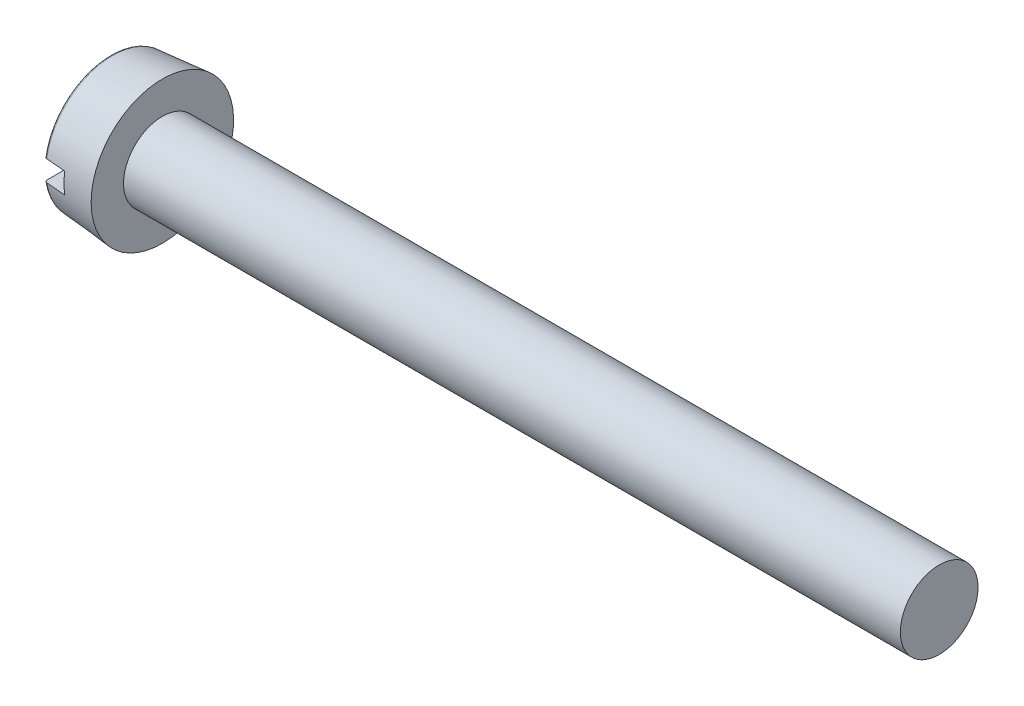
ISO-10303-21;
HEADER;
FILE_DESCRIPTION(('STEP AP214'),'2;1');
FILE_NAME('part.step','',(''),(''),'','','');
FILE_SCHEMA(('AUTOMOTIVE_DESIGN { 1 0 10303 214 1 1 1 1 }'));
ENDSEC;
DATA;
#1=APPLICATION_CONTEXT('core data for automotive mechanical design processes');
#2=APPLICATION_PROTOCOL_DEFINITION('international standard','automotive_design',2000,#1);
#3=PRODUCT_CONTEXT('',#1,'mechanical');
#4=PRODUCT('Part','Part','',(#3));
#5=PRODUCT_RELATED_PRODUCT_CATEGORY('part','',(#4));
#6=PRODUCT_DEFINITION_FORMATION('','',#4);
#7=PRODUCT_DEFINITION_CONTEXT('part definition',#1,'design');
#8=PRODUCT_DEFINITION('design','',#6,#7);
#9=PRODUCT_DEFINITION_SHAPE('','',#8);
#10=(LENGTH_UNIT() NAMED_UNIT(*) SI_UNIT(.MILLI.,.METRE.));
#11=(NAMED_UNIT(*) PLANE_ANGLE_UNIT() SI_UNIT($,.RADIAN.));
#12=(NAMED_UNIT(*) SI_UNIT($,.STERADIAN.) SOLID_ANGLE_UNIT());
#13=UNCERTAINTY_MEASURE_WITH_UNIT(LENGTH_MEASURE(1.E-05),#10,'distance_accuracy_value','');
#14=(GEOMETRIC_REPRESENTATION_CONTEXT(3) GLOBAL_UNCERTAINTY_ASSIGNED_CONTEXT((#13)) GLOBAL_UNIT_ASSIGNED_CONTEXT((#10,
#11,#12)) REPRESENTATION_CONTEXT('',''));
#15=CARTESIAN_POINT('',(0.,0.,0.));
#16=DIRECTION('',(0.,0.,1.));
#17=DIRECTION('',(1.,0.,0.));
#18=AXIS2_PLACEMENT_3D('',#15,#16,#17);
#19=CARTESIAN_POINT('',(0.,0.,0.));
#20=DIRECTION('',(-1.,0.,0.));
#21=DIRECTION('',(0.,0.,1.));
#22=AXIS2_PLACEMENT_3D('',#19,#20,#21);
#23=PLANE('',#22);
#24=DIRECTION('',(0.,0.,-1.));
#25=VECTOR('',#24,1.);
#26=CARTESIAN_POINT('',(0.,0.4,2.75));
#27=LINE('',#26,#25);
#28=CARTESIAN_POINT('',(0.,0.4,2.45096382768024));
#29=VERTEX_POINT('',#28);
#30=CARTESIAN_POINT('',(0.,0.4,-2.45096382768024));
#31=VERTEX_POINT('',#30);
#32=EDGE_CURVE('E106',#29,#31,#27,.T.);
#33=ORIENTED_EDGE('',*,*,#32,.F.);
#34=CARTESIAN_POINT('',(0.,0.,0.));
#35=DIRECTION('',(-1.,0.,0.));
#36=DIRECTION('',(0.,0.,1.));
#37=AXIS2_PLACEMENT_3D('',#34,#35,#36);
#38=CIRCLE('',#37,2.48338955554641);
#39=EDGE_CURVE('E108',#29,#31,#38,.T.);
#40=ORIENTED_EDGE('',*,*,#39,.T.);
#41=EDGE_LOOP('',(#33,#40));
#42=FACE_BOUND('',#41,.T.);
#43=ADVANCED_FACE('F37',(#42),#23,.T.);
#44=CARTESIAN_POINT('',(0.1,0.,0.));
#45=DIRECTION('',(-1.,0.,0.));
#46=DIRECTION('',(0.,0.,1.));
#47=AXIS2_PLACEMENT_3D('',#44,#45,#46);
#48=TOROIDAL_SURFACE('',#47,2.48338955554641,0.1);
#49=CARTESIAN_POINT('',(0.0289938380211758,0.4,-2.52228316549766));
#50=CARTESIAN_POINT('',(0.0329146400399008,0.4,-2.52628601737879));
#51=CARTESIAN_POINT('',(0.0371732059087858,0.4,-2.52996330795833));
#52=CARTESIAN_POINT('',(0.0462494374841123,0.4,-2.53655558833691));
#53=CARTESIAN_POINT('',(0.0510676904570524,0.4,-2.53946976679747));
#54=CARTESIAN_POINT('',(0.061126618897454,0.4,-2.54444525866304));
#55=CARTESIAN_POINT('',(0.0663672780390149,0.4,-2.54650660501096));
#56=CARTESIAN_POINT('',(0.0771205298537036,0.4,-2.5497128714041));
#57=CARTESIAN_POINT('',(0.0826330564249979,0.4,-2.55085801306043));
#58=CARTESIAN_POINT('',(0.0937360108304329,0.4,-2.55219318080891));
#59=CARTESIAN_POINT('',(0.0993256947509507,0.4,-2.55238939597481));
#60=CARTESIAN_POINT('',(0.110458306622038,0.4,-2.55183747650024));
#61=CARTESIAN_POINT('',(0.116001234198317,0.4,-2.55108933430727));
#62=CARTESIAN_POINT('',(0.12686581978363,0.4,-2.54867516285271));
#63=CARTESIAN_POINT('',(0.132188090847035,0.4,-2.54701188972794));
#64=CARTESIAN_POINT('',(0.142479668135713,0.4,-2.54281935144472));
#65=CARTESIAN_POINT('',(0.147448970444545,0.4,-2.54029007667919));
#66=CARTESIAN_POINT('',(0.156919019556883,0.4,-2.53442699567865));
#67=CARTESIAN_POINT('',(0.161417530686884,0.4,-2.53108957986598));
#68=CARTESIAN_POINT('',(0.169797583318729,0.4,-2.52371398467404));
#69=CARTESIAN_POINT('',(0.173679096427555,0.4,-2.51967577306341));
#70=CARTESIAN_POINT('',(0.180758379631838,0.4,-2.51096934806693));
#71=CARTESIAN_POINT('',(0.183948691710373,0.4,-2.50629507144611));
#72=CARTESIAN_POINT('',(0.189510239570671,0.4,-2.49648236653712));
#73=CARTESIAN_POINT('',(0.191881421883502,0.4,-2.49134390797695));
#74=CARTESIAN_POINT('',(0.195767027940457,0.4,-2.480682205207));
#75=CARTESIAN_POINT('',(0.197270760971853,0.4,-2.47515506403468));
#76=CARTESIAN_POINT('',(0.199338128353477,0.4,-2.46392763420021));
#77=CARTESIAN_POINT('',(0.199901709526225,0.4,-2.45822733576239));
#78=CARTESIAN_POINT('',(0.20007548133907,0.4,-2.44676112412241));
#79=CARTESIAN_POINT('',(0.199677113345941,0.4,-2.44099507954687));
#80=CARTESIAN_POINT('',(0.197919889661747,0.4,-2.42961109138142));
#81=CARTESIAN_POINT('',(0.196561010768147,0.4,-2.42399315137259));
#82=CARTESIAN_POINT('',(0.192915627153958,0.4,-2.41305590565846));
#83=CARTESIAN_POINT('',(0.190627555523932,0.4,-2.40773712175833));
#84=CARTESIAN_POINT('',(0.185185000915828,0.4,-2.39756279520369));
#85=CARTESIAN_POINT('',(0.182030540035586,0.4,-2.39270724073845));
#86=CARTESIAN_POINT('',(0.174965864483064,0.4,-2.38363467595376));
#87=CARTESIAN_POINT('',(0.17106099829442,0.4,-2.37941350258365));
#88=CARTESIAN_POINT('',(0.162589830789107,0.4,-2.37169707517616));
#89=CARTESIAN_POINT('',(0.158023574903146,0.4,-2.36820177131908));
#90=CARTESIAN_POINT('',(0.148421596079081,0.4,-2.36208459946197));
#91=CARTESIAN_POINT('',(0.14339263640465,0.4,-2.35945211619946));
#92=CARTESIAN_POINT('',(0.132960042691407,0.4,-2.35508144798975));
#93=CARTESIAN_POINT('',(0.127556438263748,0.4,-2.35334319245586));
#94=CARTESIAN_POINT('',(0.116602502745339,0.4,-2.35083201602087));
#95=CARTESIAN_POINT('',(0.111054942498254,0.4,-2.35004699968965));
#96=CARTESIAN_POINT('',(0.0999070705254344,0.4,-2.3494263065429));
#97=CARTESIAN_POINT('',(0.0943067613612006,0.4,-2.34959058386431));
#98=CARTESIAN_POINT('',(0.0832511443149576,0.4,-2.35085902950956));
#99=CARTESIAN_POINT('',(0.0777951256899436,0.4,-2.3519570180145));
#100=CARTESIAN_POINT('',(0.0671440893672225,0.4,-2.35505088710293));
#101=CARTESIAN_POINT('',(0.0619490721184748,0.4,-2.35704676923086));
#102=CARTESIAN_POINT('',(0.0519500535749688,0.4,-2.36188301447907));
#103=CARTESIAN_POINT('',(0.0471472182076571,0.4,-2.36472578664258));
#104=CARTESIAN_POINT('',(0.038080294755097,0.4,-2.37116917771983));
#105=CARTESIAN_POINT('',(0.0338162339656365,0.4,-2.37476983500548));
#106=CARTESIAN_POINT('',(0.0258978392798659,0.4,-2.38266730942151));
#107=CARTESIAN_POINT('',(0.0222505790304378,0.4,-2.38697121737475));
#108=CARTESIAN_POINT('',(0.0157188388686,0.4,-2.39612333377568));
#109=CARTESIAN_POINT('',(0.0128344147286459,0.4,-2.40097158198427));
#110=CARTESIAN_POINT('',(0.00786953684593871,0.4,-2.41114518595604));
#111=CARTESIAN_POINT('',(0.00580049504437317,0.4,-2.41647611188959));
#112=CARTESIAN_POINT('',(0.0025766828223988,0.4,-2.4274074136993));
#113=CARTESIAN_POINT('',(0.00142193421228871,0.4,-2.4330077959999));
#114=CARTESIAN_POINT('',(4.98309082451478E-05,0.4,-2.44437919860998));
#115=CARTESIAN_POINT('',(-0.000158040154989019,0.4,-2.45015136490808));
#116=CARTESIAN_POINT('',(0.000395629680353794,0.4,-2.46165070249477));
#117=CARTESIAN_POINT('',(0.00115743264880506,0.4,-2.46737786119837));
#118=CARTESIAN_POINT('',(0.00363465605126292,0.4,-2.47863907342415));
#119=CARTESIAN_POINT('',(0.0053528137035001,0.4,-2.48417252398631));
#120=CARTESIAN_POINT('',(0.00969850669250343,0.4,-2.49486489969062));
#121=CARTESIAN_POINT('',(0.0123249394519184,0.4,-2.50002426979425));
#122=CARTESIAN_POINT('',(0.0173136943959969,0.4,-2.50805181152184));
#123=CARTESIAN_POINT('',(0.019430082640619,0.4,-2.51107561025655));
#124=CARTESIAN_POINT('',(0.0239801784125786,0.4,-2.51687431501129));
#125=CARTESIAN_POINT('',(0.0264138847052187,0.4,-2.5196492219997));
#126=CARTESIAN_POINT('',(0.0289938380211758,0.4,-2.52228316549766));
#127=B_SPLINE_CURVE_WITH_KNOTS('',3,(#49,#50,#51,#52,#53,#54,#55,#56,#57,#58,#59,#60,#61,#62,
#63,#64,#65,#66,#67,#68,#69,#70,#71,#72,#73,#74,#75,#76,#77,#78,#79,#80,#81,#82,#83,#84,#85,#86,
#87,#88,#89,#90,#91,#92,#93,#94,#95,#96,#97,#98,#99,#100,#101,#102,#103,#104,#105,#106,#107,
#108,#109,#110,#111,#112,#113,#114,#115,#116,#117,#118,#119,#120,#121,#122,#123,#124,#125,#126),
.UNSPECIFIED.,.T.,.F.,(4,2,2,2,2,2,2,2,2,2,2,2,2,2,2,2,2,2,2,2,2,2,2,2,2,2,2,2,2,2,2,2,2,2,2,2,
2,2,4),(0.,0.0167962438770802,0.0336102736228912,0.0504236538216824,0.0672329659785202,
0.0839324954656501,0.100632158508098,0.11728179964717,0.133931625497132,0.150657236214899,
0.167383616389182,0.184282358747594,0.201182203967943,0.218286107817179,0.235390979075726,
0.252648595290838,0.269906628402955,0.287193885606231,0.304480701927405,0.321648593971803,
0.338815307316329,0.355762112546912,0.372707579860325,0.389435704571816,0.406163021106999,
0.422780481006365,0.439397969489147,0.456063186523276,0.472729247524451,0.489575093862968,
0.506422171494332,0.523497308438318,0.540572852694337,0.557819049576411,0.575069908508114,
0.592370397548948,0.609649958399181,0.620702210843321,0.631754420283977),.UNSPECIFIED.);
#128=CARTESIAN_POINT('',(0.0912844257252299,0.4,-2.5518494518816));
#129=VERTEX_POINT('',#128);
#130=EDGE_CURVE('E61',#31,#129,#127,.T.);
#131=ORIENTED_EDGE('',*,*,#130,.F.);
#132=ORIENTED_EDGE('',*,*,#39,.F.);
#133=CARTESIAN_POINT('',(0.0367676987021643,0.4,2.37243473528728));
#134=CARTESIAN_POINT('',(0.0410691072562519,0.4,2.36887462682049));
#135=CARTESIAN_POINT('',(0.0456712476146379,0.4,2.36567202074306));
#136=CARTESIAN_POINT('',(0.0553504912178822,0.4,2.36008032650183));
#137=CARTESIAN_POINT('',(0.0604280839551132,0.4,2.35769208875703));
#138=CARTESIAN_POINT('',(0.0709135886904199,0.4,2.35380489827384));
#139=CARTESIAN_POINT('',(0.0763214938192331,0.4,2.35230592704897));
#140=CARTESIAN_POINT('',(0.0873116719417479,0.4,2.35024450872371));
#141=CARTESIAN_POINT('',(0.0928939027986416,0.4,2.34968183706536));
#142=CARTESIAN_POINT('',(0.104036601297581,0.4,2.34951039508072));
#143=CARTESIAN_POINT('',(0.109596974662459,0.4,2.34989545024077));
#144=CARTESIAN_POINT('',(0.120573920357346,0.4,2.35159460899385));
#145=CARTESIAN_POINT('',(0.125990490202903,0.4,2.35290872862725));
#146=CARTESIAN_POINT('',(0.136522391247531,0.4,2.35642416504567));
#147=CARTESIAN_POINT('',(0.141637967615106,0.4,2.35862474798458));
#148=CARTESIAN_POINT('',(0.151431222534294,0.4,2.36384674458521));
#149=CARTESIAN_POINT('',(0.156108887376012,0.4,2.36686818393429));
#150=CARTESIAN_POINT('',(0.164936002938918,0.4,2.37367095440966));
#151=CARTESIAN_POINT('',(0.16908079389346,0.4,2.3774583297866));
#152=CARTESIAN_POINT('',(0.176685910750912,0.4,2.38566704388047));
#153=CARTESIAN_POINT('',(0.180146192360979,0.4,2.39008842359027));
#154=CARTESIAN_POINT('',(0.186332746435633,0.4,2.39950205527751));
#155=CARTESIAN_POINT('',(0.189048713902264,0.4,2.40450107962601));
#156=CARTESIAN_POINT('',(0.193614409893133,0.4,2.41488017557624));
#157=CARTESIAN_POINT('',(0.195464077650946,0.4,2.42026027387786));
#158=CARTESIAN_POINT('',(0.198266231334811,0.4,2.43131856240102));
#159=CARTESIAN_POINT('',(0.199207620171234,0.4,2.43699956654937));
#160=CARTESIAN_POINT('',(0.20012925691986,0.4,2.4484391128062));
#161=CARTESIAN_POINT('',(0.200109464431673,0.4,2.45419765816372));
#162=CARTESIAN_POINT('',(0.199105792419158,0.4,2.46566309979117));
#163=CARTESIAN_POINT('',(0.198116473192368,0.4,2.47136952123461));
#164=CARTESIAN_POINT('',(0.195191128966346,0.4,2.48253449565389));
#165=CARTESIAN_POINT('',(0.193255106776879,0.4,2.48799304936533));
#166=CARTESIAN_POINT('',(0.188494675278442,0.4,2.49848893070217));
#167=CARTESIAN_POINT('',(0.185672880951562,0.4,2.50352744366316));
#168=CARTESIAN_POINT('',(0.17921549855744,0.4,2.51305299197626));
#169=CARTESIAN_POINT('',(0.175579948629359,0.4,2.51754005315861));
#170=CARTESIAN_POINT('',(0.167635478825505,0.4,2.52578731588122));
#171=CARTESIAN_POINT('',(0.163333512373971,0.4,2.5295542142048));
#172=CARTESIAN_POINT('',(0.15415155549012,0.4,2.53630156216166));
#173=CARTESIAN_POINT('',(0.149271604711318,0.4,2.53928206570155));
#174=CARTESIAN_POINT('',(0.13913635307135,0.4,2.54433379308572));
#175=CARTESIAN_POINT('',(0.133886369113006,0.4,2.54641568563766));
#176=CARTESIAN_POINT('',(0.12310939474746,0.4,2.54965893225548));
#177=CARTESIAN_POINT('',(0.117582421034198,0.4,2.55082034172732));
#178=CARTESIAN_POINT('',(0.106464698916145,0.4,2.55218028189334));
#179=CARTESIAN_POINT('',(0.100875054594366,0.4,2.55238785185234));
#180=CARTESIAN_POINT('',(0.0897407847209884,0.4,2.55185843737951));
#181=CARTESIAN_POINT('',(0.0841961579348964,0.4,2.55112147893765));
#182=CARTESIAN_POINT('',(0.0733265657266888,0.4,2.54872918263962));
#183=CARTESIAN_POINT('',(0.0680009847337694,0.4,2.54707663871121));
#184=CARTESIAN_POINT('',(0.0577010526378295,0.4,2.54290481605141));
#185=CARTESIAN_POINT('',(0.0527267057044024,0.4,2.54038552703274));
#186=CARTESIAN_POINT('',(0.0432451955154216,0.4,2.53454156724995));
#187=CARTESIAN_POINT('',(0.038740238948066,0.4,2.53121331773258));
#188=CARTESIAN_POINT('',(0.0303458654217717,0.4,2.52385482922166));
#189=CARTESIAN_POINT('',(0.0264564786942822,0.4,2.51982455577117));
#190=CARTESIAN_POINT('',(0.0193602742266985,0.4,2.51113277232454));
#191=CARTESIAN_POINT('',(0.016160883105245,0.4,2.50646520000313));
#192=CARTESIAN_POINT('',(0.0105801862776836,0.4,2.49666430232761));
#193=CARTESIAN_POINT('',(0.00819893477648334,0.4,2.491530946142));
#194=CARTESIAN_POINT('',(0.00429230007908589,0.4,2.48087765570879));
#195=CARTESIAN_POINT('',(0.00277761888662445,0.4,2.47535379620009));
#196=CARTESIAN_POINT('',(0.00068799544056708,0.4,2.46413127035624));
#197=CARTESIAN_POINT('',(0.000113070892212463,0.4,2.45843260072968));
#198=CARTESIAN_POINT('',(-8.37002456025671E-05,0.4,2.44696818040157));
#199=CARTESIAN_POINT('',(0.000302941335767599,0.4,2.44120228266165));
#200=CARTESIAN_POINT('',(0.0020370100173356,0.4,2.42981508207598));
#201=CARTESIAN_POINT('',(0.00338469494754002,0.4,2.42419381845226));
#202=CARTESIAN_POINT('',(0.00700896577894915,0.4,2.41324562761761));
#203=CARTESIAN_POINT('',(0.00928760515722934,0.4,2.40791938083122));
#204=CARTESIAN_POINT('',(0.0147114792186617,0.4,2.39773348978099));
#205=CARTESIAN_POINT('',(0.0178556585516148,0.4,2.39287328693998));
#206=CARTESIAN_POINT('',(0.0236503626604921,0.4,2.38539954815907));
#207=CARTESIAN_POINT('',(0.0260726096208587,0.4,2.38260604033144));
#208=CARTESIAN_POINT('',(0.0312086078085589,0.4,2.37730112356));
#209=CARTESIAN_POINT('',(0.0339223576900255,0.4,2.37478971331387));
#210=CARTESIAN_POINT('',(0.0367676987021643,0.4,2.37243473528728));
#211=B_SPLINE_CURVE_WITH_KNOTS('',3,(#133,#134,#135,#136,#137,#138,#139,#140,#141,#142,#143,
#144,#145,#146,#147,#148,#149,#150,#151,#152,#153,#154,#155,#156,#157,#158,#159,#160,#161,#162,
#163,#164,#165,#166,#167,#168,#169,#170,#171,#172,#173,#174,#175,#176,#177,#178,#179,#180,#181,
#182,#183,#184,#185,#186,#187,#188,#189,#190,#191,#192,#193,#194,#195,#196,#197,#198,#199,#200,
#201,#202,#203,#204,#205,#206,#207,#208,#209,#210),.UNSPECIFIED.,.T.,.F.,(4,2,2,2,2,2,2,2,2,2,2,
2,2,2,2,2,2,2,2,2,2,2,2,2,2,2,2,2,2,2,2,2,2,2,2,2,2,2,4),(0.,0.0167374978406355,
0.0334924209723803,0.0502469957829487,0.0669975516708022,0.0836392656129614,0.100281266882441,
0.116909519525703,0.133538292583203,0.150303803185788,0.167070398286947,0.18405857971598,
0.201047952599288,0.218242362613188,0.235437495343469,0.252729660021829,0.270021773378245,
0.287263309496308,0.304504037705845,0.321575685446243,0.338646162637364,0.35550798995053,
0.372368802234774,0.389069495340301,0.405769728913956,0.422419279849294,0.439069028402679,
0.455793818907913,0.472519430535029,0.489416954805598,0.506315598386582,0.523418666684378,
0.540522057204383,0.557776961903069,0.57503649751328,0.592334311120995,0.609611126268918,
0.620682873655479,0.631754569926062),.UNSPECIFIED.);
#212=CARTESIAN_POINT('',(0.0912844257243784,0.4,2.55184945188522));
#213=VERTEX_POINT('',#212);
#214=EDGE_CURVE('E98',#213,#29,#211,.T.);
#215=ORIENTED_EDGE('',*,*,#214,.F.);
#216=CARTESIAN_POINT('',(0.0912844257252299,0.,0.));
#217=DIRECTION('',(-1.,0.,0.));
#218=DIRECTION('',(0.,0.,1.));
#219=AXIS2_PLACEMENT_3D('',#216,#217,#218);
#220=CIRCLE('',#219,2.58300902535558);
#221=EDGE_CURVE('E112',#129,#213,#220,.F.);
#222=ORIENTED_EDGE('',*,*,#221,.F.);
#223=EDGE_LOOP('',(#131,#132,#215,#222));
#224=FACE_BOUND('',#223,.T.);
#225=ADVANCED_FACE('F189',(#224),#48,.T.);
#226=CARTESIAN_POINT('',(-25.4,0.,0.));
#227=DIRECTION('',(-1.,0.,0.));
#228=DIRECTION('',(0.,0.,1.));
#229=AXIS2_PLACEMENT_3D('',#226,#227,#228);
#230=CYLINDRICAL_SURFACE('',#229,1.5);
#231=CARTESIAN_POINT('',(32.,0.,0.));
#232=DIRECTION('',(-1.,0.,0.));
#233=DIRECTION('',(0.,0.,1.));
#234=AXIS2_PLACEMENT_3D('',#231,#232,#233);
#235=CIRCLE('',#234,1.5);
#236=CARTESIAN_POINT('',(32.,0.,1.5));
#237=VERTEX_POINT('',#236);
#238=EDGE_CURVE('E109',#237,#237,#235,.T.);
#239=ORIENTED_EDGE('',*,*,#238,.T.);
#240=EDGE_LOOP('',(#239));
#241=FACE_BOUND('',#240,.T.);
#242=CARTESIAN_POINT('',(2.,0.,0.));
#243=DIRECTION('',(-1.,0.,0.));
#244=DIRECTION('',(0.,0.,1.));
#245=AXIS2_PLACEMENT_3D('',#242,#243,#244);
#246=CIRCLE('',#245,1.5);
#247=CARTESIAN_POINT('',(2.,0.,1.5));
#248=VERTEX_POINT('',#247);
#249=EDGE_CURVE('E176',#248,#248,#246,.T.);
#250=ORIENTED_EDGE('',*,*,#249,.F.);
#251=EDGE_LOOP('',(#250));
#252=FACE_BOUND('',#251,.T.);
#253=ADVANCED_FACE('F186',(#241,#252),#230,.T.);
#254=CARTESIAN_POINT('',(32.,1.5,0.));
#255=DIRECTION('',(1.,0.,0.));
#256=DIRECTION('',(0.,0.,-1.));
#257=AXIS2_PLACEMENT_3D('',#254,#255,#256);
#258=PLANE('',#257);
#259=ORIENTED_EDGE('',*,*,#238,.F.);
#260=EDGE_LOOP('',(#259));
#261=FACE_BOUND('',#260,.T.);
#262=ADVANCED_FACE('F188',(#261),#258,.T.);
#263=DIRECTION('',(0.,0.,1.));
#264=VECTOR('',#263,1.);
#265=CARTESIAN_POINT('',(0.,-0.4,-2.75));
#266=LINE('',#265,#264);
#267=CARTESIAN_POINT('',(0.,-0.4,-2.45096382768024));
#268=VERTEX_POINT('',#267);
#269=CARTESIAN_POINT('',(0.,-0.4,2.45096382768024));
#270=VERTEX_POINT('',#269);
#271=EDGE_CURVE('E53',#268,#270,#266,.T.);
#272=ORIENTED_EDGE('',*,*,#271,.F.);
#273=EDGE_CURVE('E104',#268,#270,#38,.T.);
#274=ORIENTED_EDGE('',*,*,#273,.T.);
#275=EDGE_LOOP('',(#272,#274));
#276=FACE_BOUND('',#275,.T.);
#277=ADVANCED_FACE('F103',(#276),#23,.T.);
#278=CARTESIAN_POINT('',(0.,0.,0.));
#279=DIRECTION('',(1.,0.,0.));
#280=DIRECTION('',(0.,0.,-1.));
#281=AXIS2_PLACEMENT_3D('',#278,#279,#280);
#282=CONICAL_SURFACE('',#281,2.57502267294815,0.0872664625997166);
#283=CARTESIAN_POINT('',(-4.36225986914578,0.4,-2.15659249784001));
#284=CARTESIAN_POINT('',(-3.0225287932993,0.4,-2.27578971400985));
#285=CARTESIAN_POINT('',(-1.68277158070832,0.4,-2.3946924855258));
#286=CARTESIAN_POINT('',(-0.0871929715729559,0.4,-2.53604555798389));
#287=CARTESIAN_POINT('',(0.168610376643266,0.4,-2.55869953286896));
#288=CARTESIAN_POINT('',(2.02000114161503,0.4,-2.72260692865391));
#289=CARTESIAN_POINT('',(3.61561248830953,0.4,-2.86359016848939));
#290=CARTESIAN_POINT('',(5.21123588736543,0.4,-3.00443640584799));
#291=B_SPLINE_CURVE_WITH_KNOTS('',3,(#283,#284,#285,#286,#287,#288,#289,#290),.UNSPECIFIED.,.F.,
.F.,(4,2,2,4),(0.,4.03506939923899,4.80548292410975,9.61096578658458),.UNSPECIFIED.);
#292=CARTESIAN_POINT('',(0.85,0.4,-2.61901832187334));
#293=VERTEX_POINT('',#292);
#294=EDGE_CURVE('E170',#129,#293,#291,.T.);
#295=ORIENTED_EDGE('',*,*,#294,.F.);
#296=ORIENTED_EDGE('',*,*,#221,.T.);
#297=CARTESIAN_POINT('',(5.21123588736543,0.4,3.00443640584799));
#298=CARTESIAN_POINT('',(4.41342358696222,0.4,2.93401988873196));
#299=CARTESIAN_POINT('',(3.61561486907633,0.4,2.86356274948076));
#300=CARTESIAN_POINT('',(2.02000692465129,0.4,2.72254136292326));
#301=CARTESIAN_POINT('',(1.22220769811185,0.4,2.65197711562021));
#302=CARTESIAN_POINT('',(-0.373378996688641,0.4,2.51071564393346));
#303=CARTESIAN_POINT('',(-1.17116646494953,0.4,2.44001841954794));
#304=CARTESIAN_POINT('',(-2.76672581923324,0.4,2.298448092182));
#305=CARTESIAN_POINT('',(-3.56449770525557,0.4,2.22757498919617));
#306=CARTESIAN_POINT('',(-4.36225986914578,0.4,2.15659249784001));
#307=B_SPLINE_CURVE_WITH_KNOTS('',3,(#297,#298,#299,#300,#301,#302,#303,#304,#305,#306),
.UNSPECIFIED.,.F.,.F.,(4,2,2,2,4),(0.,2.40274147318214,4.80548287330204,7.20822430613116,
9.6109658126378),.UNSPECIFIED.);
#308=CARTESIAN_POINT('',(0.85,0.4,2.61901832187334));
#309=VERTEX_POINT('',#308);
#310=EDGE_CURVE('E165',#309,#213,#307,.T.);
#311=ORIENTED_EDGE('',*,*,#310,.F.);
#312=CARTESIAN_POINT('',(0.85,0.,0.));
#313=DIRECTION('',(-1.,0.,0.));
#314=DIRECTION('',(0.,0.,1.));
#315=AXIS2_PLACEMENT_3D('',#312,#313,#314);
#316=CIRCLE('',#315,2.64938803694519);
#317=CARTESIAN_POINT('',(0.85,-0.4,2.61901832187334));
#318=VERTEX_POINT('',#317);
#319=EDGE_CURVE('E42',#309,#318,#316,.F.);
#320=ORIENTED_EDGE('',*,*,#319,.T.);
#321=CARTESIAN_POINT('',(-4.36225986914578,-0.4,2.15659249784001));
#322=CARTESIAN_POINT('',(-3.0225287932993,-0.4,2.27578971400985));
#323=CARTESIAN_POINT('',(-1.68277158070832,-0.4,2.3946924855258));
#324=CARTESIAN_POINT('',(-0.0871929715729559,-0.4,2.53604555798389));
#325=CARTESIAN_POINT('',(0.168610376643266,-0.4,2.55869953286896));
#326=CARTESIAN_POINT('',(2.02000114161503,-0.400000000000001,2.72260692865391));
#327=CARTESIAN_POINT('',(3.61561248830953,-0.400000000000001,2.86359016848939));
#328=CARTESIAN_POINT('',(5.21123588736543,-0.4,3.00443640584799));
#329=B_SPLINE_CURVE_WITH_KNOTS('',3,(#321,#322,#323,#324,#325,#326,#327,#328),.UNSPECIFIED.,.F.,
.F.,(4,2,2,4),(0.,4.03506939923899,4.80548292410975,9.61096578658458),.UNSPECIFIED.);
#330=CARTESIAN_POINT('',(0.0912844257241088,-0.4,2.55184945188157));
#331=VERTEX_POINT('',#330);
#332=EDGE_CURVE('E141',#331,#318,#329,.T.);
#333=ORIENTED_EDGE('',*,*,#332,.F.);
#334=CARTESIAN_POINT('',(0.0912844257452029,-0.4,-2.55184945199817));
#335=VERTEX_POINT('',#334);
#336=EDGE_CURVE('E118',#331,#335,#220,.F.);
#337=ORIENTED_EDGE('',*,*,#336,.T.);
#338=CARTESIAN_POINT('',(5.21123588736543,-0.4,-3.00443640584799));
#339=CARTESIAN_POINT('',(4.41342358696222,-0.4,-2.93401988873196));
#340=CARTESIAN_POINT('',(3.61561486907633,-0.4,-2.86356274948076));
#341=CARTESIAN_POINT('',(2.02000692465129,-0.4,-2.72254136292326));
#342=CARTESIAN_POINT('',(1.22220769811185,-0.4,-2.65197711562021));
#343=CARTESIAN_POINT('',(-0.373378996688641,-0.4,-2.51071564393346));
#344=CARTESIAN_POINT('',(-1.17116646494953,-0.4,-2.44001841954794));
#345=CARTESIAN_POINT('',(-2.76672581923324,-0.4,-2.298448092182));
#346=CARTESIAN_POINT('',(-3.56449770525557,-0.4,-2.22757498919617));
#347=CARTESIAN_POINT('',(-4.36225986914578,-0.4,-2.15659249784001));
#348=B_SPLINE_CURVE_WITH_KNOTS('',3,(#338,#339,#340,#341,#342,#343,#344,#345,#346,#347),
.UNSPECIFIED.,.F.,.F.,(4,2,2,2,4),(0.,2.40274147318214,4.80548287330204,7.20822430613116,
9.6109658126378),.UNSPECIFIED.);
#349=CARTESIAN_POINT('',(0.85,-0.4,-2.61901832187334));
#350=VERTEX_POINT('',#349);
#351=EDGE_CURVE('E93',#350,#335,#348,.T.);
#352=ORIENTED_EDGE('',*,*,#351,.F.);
#353=EDGE_CURVE('E11',#350,#293,#316,.F.);
#354=ORIENTED_EDGE('',*,*,#353,.T.);
#355=EDGE_LOOP('',(#295,#296,#311,#320,#333,#337,#352,#354));
#356=FACE_BOUND('',#355,.T.);
#357=CARTESIAN_POINT('',(2.,0.,0.));
#358=DIRECTION('',(-1.,0.,0.));
#359=DIRECTION('',(0.,0.,1.));
#360=AXIS2_PLACEMENT_3D('',#357,#358,#359);
#361=CIRCLE('',#360,2.75);
#362=CARTESIAN_POINT('',(2.,0.,2.75));
#363=VERTEX_POINT('',#362);
#364=EDGE_CURVE('E114',#363,#363,#361,.T.);
#365=ORIENTED_EDGE('',*,*,#364,.T.);
#366=EDGE_LOOP('',(#365));
#367=FACE_BOUND('',#366,.T.);
#368=ADVANCED_FACE('F154',(#356,#367),#282,.T.);
#369=CARTESIAN_POINT('',(2.,1.5,0.));
#370=DIRECTION('',(-1.,0.,0.));
#371=DIRECTION('',(0.,0.,1.));
#372=AXIS2_PLACEMENT_3D('',#369,#370,#371);
#373=PLANE('',#372);
#374=ORIENTED_EDGE('',*,*,#364,.F.);
#375=EDGE_LOOP('',(#374));
#376=FACE_BOUND('',#375,.T.);
#377=ORIENTED_EDGE('',*,*,#249,.T.);
#378=EDGE_LOOP('',(#377));
#379=FACE_BOUND('',#378,.T.);
#380=ADVANCED_FACE('F158',(#376,#379),#373,.F.);
#381=CARTESIAN_POINT('',(0.0289938380211757,-0.4,-2.52228316549766));
#382=CARTESIAN_POINT('',(0.025004069125932,-0.4,-2.51820918183003));
#383=CARTESIAN_POINT('',(0.0213583190112083,-0.4,-2.51379201367196));
#384=CARTESIAN_POINT('',(0.0148592785644251,-0.4,-2.50440306026762));
#385=CARTESIAN_POINT('',(0.0120070700796538,-0.4,-2.49943053069829));
#386=CARTESIAN_POINT('',(0.00717770347925433,-0.4,-2.48908271582266));
#387=CARTESIAN_POINT('',(0.00519971746694653,-0.4,-2.48370781723002));
#388=CARTESIAN_POINT('',(0.00216717495668322,-0.4,-2.47270542437941));
#389=CARTESIAN_POINT('',(0.00111238322136104,-0.4,-2.4670779948528));
#390=CARTESIAN_POINT('',(-5.25582059453137E-05,-0.4,-2.45568286085502));
#391=CARTESIAN_POINT('',(-0.000155467825421262,-0.4,-2.44991441534212));
#392=CARTESIAN_POINT('',(0.000604499959018262,-0.4,-2.43844109806142));
#393=CARTESIAN_POINT('',(0.00146745336414966,-0.4,-2.43273623133216));
#394=CARTESIAN_POINT('',(0.00414151157260963,-0.4,-2.42152987250594));
#395=CARTESIAN_POINT('',(0.00595623339048468,-0.4,-2.41602924255959));
#396=CARTESIAN_POINT('',(0.0104876390060404,-0.4,-2.40541275972393));
#397=CARTESIAN_POINT('',(0.0132043100000633,-0.4,-2.40029690137383));
#398=CARTESIAN_POINT('',(0.0194512493609962,-0.4,-2.39062289289039));
#399=CARTESIAN_POINT('',(0.0229775960031605,-0.4,-2.38606221159139));
#400=CARTESIAN_POINT('',(0.0307542280705712,-0.4,-2.37760643337986));
#401=CARTESIAN_POINT('',(0.0350044686960857,-0.4,-2.37371129530862));
#402=CARTESIAN_POINT('',(0.0440555019555723,-0.4,-2.3667470396541));
#403=CARTESIAN_POINT('',(0.0488492409468844,-0.4,-2.36366875652182));
#404=CARTESIAN_POINT('',(0.0588909820215912,-0.4,-2.3583735233016));
#405=CARTESIAN_POINT('',(0.0641389481441079,-0.4,-2.35615650510399));
#406=CARTESIAN_POINT('',(0.0748640783279191,-0.4,-2.35267719664892));
#407=CARTESIAN_POINT('',(0.0803372009928295,-0.4,-2.35140244386474));
#408=CARTESIAN_POINT('',(0.0914202264447995,-0.4,-2.34979886854023));
#409=CARTESIAN_POINT('',(0.0970301209943443,-0.4,-2.34946998917295));
#410=CARTESIAN_POINT('',(0.108175670502414,-0.4,-2.34976708273981));
#411=CARTESIAN_POINT('',(0.113711547505791,-0.4,-2.35038480500947));
#412=CARTESIAN_POINT('',(0.124600906547844,-0.4,-2.35254069219937));
#413=CARTESIAN_POINT('',(0.129954390579146,-0.4,-2.35407884706056));
#414=CARTESIAN_POINT('',(0.140330562478326,-0.4,-2.35802931008484));
#415=CARTESIAN_POINT('',(0.145353122327479,-0.4,-2.36044195422667));
#416=CARTESIAN_POINT('',(0.1549268792096,-0.4,-2.36606888937863));
#417=CARTESIAN_POINT('',(0.159478058010393,-0.4,-2.36928321137984));
#418=CARTESIAN_POINT('',(0.168025501299987,-0.4,-2.37645214423981));
#419=CARTESIAN_POINT('',(0.172016319852358,-0.4,-2.38041324620994));
#420=CARTESIAN_POINT('',(0.179287042308478,-0.4,-2.3889414041015));
#421=CARTESIAN_POINT('',(0.182566897622746,-0.4,-2.3935085014042));
#422=CARTESIAN_POINT('',(0.188369159015882,-0.4,-2.40318459258693));
#423=CARTESIAN_POINT('',(0.190880811711647,-0.4,-2.40830003507254));
#424=CARTESIAN_POINT('',(0.195020891957927,-0.4,-2.41887665144677));
#425=CARTESIAN_POINT('',(0.196649260076486,-0.4,-2.42433784857194));
#426=CARTESIAN_POINT('',(0.198994072160015,-0.4,-2.43551846416644));
#427=CARTESIAN_POINT('',(0.199699802934894,-0.4,-2.44124013143329));
#428=CARTESIAN_POINT('',(0.200145599532922,-0.4,-2.45272108096227));
#429=CARTESIAN_POINT('',(0.199885628830452,-0.4,-2.45848036463892));
#430=CARTESIAN_POINT('',(0.198402716236481,-0.4,-2.46990089334109));
#431=CARTESIAN_POINT('',(0.197175332540678,-0.4,-2.47556156274737));
#432=CARTESIAN_POINT('',(0.193783964811841,-0.4,-2.48659519893132));
#433=CARTESIAN_POINT('',(0.191619990295665,-0.4,-2.49196816863173));
#434=CARTESIAN_POINT('',(0.186423491809558,-0.4,-2.5022498657427));
#435=CARTESIAN_POINT('',(0.183394426113027,-0.4,-2.50716034009667));
#436=CARTESIAN_POINT('',(0.17654674686308,-0.4,-2.51639609907409));
#437=CARTESIAN_POINT('',(0.17272817212622,-0.4,-2.52072141244994));
#438=CARTESIAN_POINT('',(0.164451603414078,-0.4,-2.52861521808819));
#439=CARTESIAN_POINT('',(0.160000663078315,-0.4,-2.5321911048007));
#440=CARTESIAN_POINT('',(0.150555440028442,-0.4,-2.53853392400498));
#441=CARTESIAN_POINT('',(0.145561193801722,-0.4,-2.54130091077496));
#442=CARTESIAN_POINT('',(0.135236369590601,-0.4,-2.54591243640717));
#443=CARTESIAN_POINT('',(0.129910608025947,-0.4,-2.54776776094683));
#444=CARTESIAN_POINT('',(0.119021928101675,-0.4,-2.55054885934361));
#445=CARTESIAN_POINT('',(0.113459032918953,-0.4,-2.55147472382786));
#446=CARTESIAN_POINT('',(0.102307195571538,-0.4,-2.55236453620601));
#447=CARTESIAN_POINT('',(0.0967189330552624,-0.4,-2.55233702605628));
#448=CARTESIAN_POINT('',(0.0856253047271046,-0.4,-2.55134185745125));
#449=CARTESIAN_POINT('',(0.0801199583532396,-0.4,-2.55037398192564));
#450=CARTESIAN_POINT('',(0.0693593931696262,-0.4,-2.5475299876823));
#451=CARTESIAN_POINT('',(0.0641037847017804,-0.4,-2.54565533854207));
#452=CARTESIAN_POINT('',(0.0539843368990685,-0.4,-2.54105571590675));
#453=CARTESIAN_POINT('',(0.0491200334774588,-0.4,-2.53833176895425));
#454=CARTESIAN_POINT('',(0.0417210877997122,-0.4,-2.53333714733838));
#455=CARTESIAN_POINT('',(0.0390206414531833,-0.4,-2.53130731123891));
#456=CARTESIAN_POINT('',(0.0338378944269697,-0.4,-2.5269861226631));
#457=CARTESIAN_POINT('',(0.0313555927448632,-0.4,-2.5246947713886));
#458=CARTESIAN_POINT('',(0.0289938380211757,-0.4,-2.52228316549766));
#459=B_SPLINE_CURVE_WITH_KNOTS('',3,(#381,#382,#383,#384,#385,#386,#387,#388,#389,#390,#391,
#392,#393,#394,#395,#396,#397,#398,#399,#400,#401,#402,#403,#404,#405,#406,#407,#408,#409,#410,
#411,#412,#413,#414,#415,#416,#417,#418,#419,#420,#421,#422,#423,#424,#425,#426,#427,#428,#429,
#430,#431,#432,#433,#434,#435,#436,#437,#438,#439,#440,#441,#442,#443,#444,#445,#446,#447,#448,
#449,#450,#451,#452,#453,#454,#455,#456,#457,#458),.UNSPECIFIED.,.T.,.F.,(4,2,2,2,2,2,2,2,2,2,2,
2,2,2,2,2,2,2,2,2,2,2,2,2,2,2,2,2,2,2,2,2,2,2,2,2,2,2,4),(0.,0.0170942392389224,
0.0342116703729632,0.0513128562267126,0.0684096832903599,0.0856364438942339,0.102864560121804,
0.120158628073267,0.137452450536552,0.154664213002626,0.171874910668652,0.188883439324029,
0.205890622654359,0.222668631829327,0.239445632980396,0.256077233802162,0.272708652867039,
0.289346468507188,0.305984927428094,0.322775300606074,0.339566820929857,0.356583638258372,
0.373601600424439,0.390815461144304,0.408029972948721,0.425323987595625,0.442617826519227,
0.459843477026109,0.477068280827689,0.494114170430573,0.511158915969806,0.527996838794441,
0.544833119675483,0.561518591762548,0.578207916374966,0.594870283327567,0.611512588116957,
0.621631616777721,0.631750598936938),.UNSPECIFIED.);
#460=EDGE_CURVE('E89',#335,#268,#459,.T.);
#461=ORIENTED_EDGE('',*,*,#460,.F.);
#462=ORIENTED_EDGE('',*,*,#336,.F.);
#463=CARTESIAN_POINT('',(0.0367676987021643,-0.4,2.37243473528728));
#464=CARTESIAN_POINT('',(0.0323825993918224,-0.4,2.376064766641));
#465=CARTESIAN_POINT('',(0.0283037127586667,-0.4,2.38007177408389));
#466=CARTESIAN_POINT('',(0.0208754097236728,-0.4,2.38871904036559));
#467=CARTESIAN_POINT('',(0.0175270033246337,-0.4,2.3933601617357));
#468=CARTESIAN_POINT('',(0.0116570776320304,-0.4,2.40313270602566));
#469=CARTESIAN_POINT('',(0.00913472821970498,-0.4,2.40826362999444));
#470=CARTESIAN_POINT('',(0.00497968232768621,-0.4,2.41887190213892));
#471=CARTESIAN_POINT('',(0.00334675788140124,-0.4,2.42434916114416));
#472=CARTESIAN_POINT('',(0.00100169668541053,-0.4,2.43554641737224));
#473=CARTESIAN_POINT('',(0.000297555212990473,-0.4,2.44126809010381));
#474=CARTESIAN_POINT('',(-0.0001451216630116,-0.4,2.45274905375029));
#475=CARTESIAN_POINT('',(0.000116421789298079,-0.4,2.45850834769892));
#476=CARTESIAN_POINT('',(0.00160247308833708,-0.4,2.46992855294402));
#477=CARTESIAN_POINT('',(0.00283141045044881,-0.4,2.47558888896036));
#478=CARTESIAN_POINT('',(0.00622581243878605,-0.4,2.486621594425));
#479=CARTESIAN_POINT('',(0.00839126662820604,-0.4,2.49199396708169));
#480=CARTESIAN_POINT('',(0.0135905931181137,-0.4,2.50227420499959));
#481=CARTESIAN_POINT('',(0.0166210040147392,-0.4,2.50718381998701));
#482=CARTESIAN_POINT('',(0.0234711987479807,-0.4,2.51641762191268));
#483=CARTESIAN_POINT('',(0.0272909405744303,-0.4,2.52074183998697));
#484=CARTESIAN_POINT('',(0.0355696248224729,-0.4,2.52863327794772));
#485=CARTESIAN_POINT('',(0.0400215149384833,-0.4,2.53220789499491));
#486=CARTESIAN_POINT('',(0.0494684030939927,-0.4,2.53854802988593));
#487=CARTESIAN_POINT('',(0.0544633641997858,-0.4,2.54131360270489));
#488=CARTESIAN_POINT('',(0.0647892630327108,-0.4,2.54592217430933));
#489=CARTESIAN_POINT('',(0.0701153800428133,-0.4,2.54777597641343));
#490=CARTESIAN_POINT('',(0.0810047128387978,-0.4,2.55055407863819));
#491=CARTESIAN_POINT('',(0.0865679149637756,-0.4,2.55147843223863));
#492=CARTESIAN_POINT('',(0.0977207563531534,-0.4,2.55236521435313));
#493=CARTESIAN_POINT('',(0.103309726295532,-0.4,2.55233608070093));
#494=CARTESIAN_POINT('',(0.114402937889977,-0.4,2.55133769001562));
#495=CARTESIAN_POINT('',(0.119907181471709,-0.4,2.55036845442587));
#496=CARTESIAN_POINT('',(0.130663236148904,-0.4,2.54752235629068));
#497=CARTESIAN_POINT('',(0.135915551335542,-0.4,2.54564739710644));
#498=CARTESIAN_POINT('',(0.146033240425047,-0.4,2.54104687692432));
#499=CARTESIAN_POINT('',(0.150898607454476,-0.4,2.53832130082098));
#500=CARTESIAN_POINT('',(0.160133532834314,-0.4,2.53208305631211));
#501=CARTESIAN_POINT('',(0.164500283568366,-0.4,2.5285662331518));
#502=CARTESIAN_POINT('',(0.172589200308648,-0.4,2.520856498684));
#503=CARTESIAN_POINT('',(0.176311333654103,-0.4,2.51666355314026));
#504=CARTESIAN_POINT('',(0.183048642136847,-0.4,2.50767286712186));
#505=CARTESIAN_POINT('',(0.186055783056341,-0.4,2.50286910685156));
#506=CARTESIAN_POINT('',(0.191231971525039,-0.4,2.49282955053378));
#507=CARTESIAN_POINT('',(0.193400964848263,-0.4,2.48759372655948));
#508=CARTESIAN_POINT('',(0.196865823745477,-0.4,2.47677152916927));
#509=CARTESIAN_POINT('',(0.198150936463139,-0.4,2.4711817121246));
#510=CARTESIAN_POINT('',(0.199773012529528,-0.4,2.4598661010716));
#511=CARTESIAN_POINT('',(0.200109924006275,-0.4,2.45414029964144));
#512=CARTESIAN_POINT('',(0.199826178778735,-0.4,2.44266501865172));
#513=CARTESIAN_POINT('',(0.199197601251489,-0.4,2.43691573330962));
#514=CARTESIAN_POINT('',(0.196985004298198,-0.4,2.42560388351766));
#515=CARTESIAN_POINT('',(0.195400968047121,-0.4,2.42004132235772));
#516=CARTESIAN_POINT('',(0.191318078557109,-0.4,2.40925817069416));
#517=CARTESIAN_POINT('',(0.188818610794393,-0.4,2.40403781269138));
#518=CARTESIAN_POINT('',(0.182972137296715,-0.4,2.39409522397092));
#519=CARTESIAN_POINT('',(0.179625156644997,-0.4,2.38937297851682));
#520=CARTESIAN_POINT('',(0.172204734064942,-0.4,2.38060178429019));
#521=CARTESIAN_POINT('',(0.168137165616085,-0.4,2.37654786844744));
#522=CARTESIAN_POINT('',(0.159371199251644,-0.4,2.36919152820335));
#523=CARTESIAN_POINT('',(0.154672845537622,-0.4,2.36588905118944));
#524=CARTESIAN_POINT('',(0.144844694580825,-0.4,2.36017590811791));
#525=CARTESIAN_POINT('',(0.139721379552863,-0.4,2.3577540912126));
#526=CARTESIAN_POINT('',(0.129137638954462,-0.4,2.35381742239515));
#527=CARTESIAN_POINT('',(0.123677253113316,-0.4,2.35230246381927));
#528=CARTESIAN_POINT('',(0.112647488636252,-0.4,2.35024006877604));
#529=CARTESIAN_POINT('',(0.107080321826037,-0.4,2.34968078927394));
#530=CARTESIAN_POINT('',(0.095930066818771,-0.4,2.34951053477204));
#531=CARTESIAN_POINT('',(0.0903469755001888,-0.4,2.34989976058669));
#532=CARTESIAN_POINT('',(0.0793550427648693,-0.4,2.35161001176195));
#533=CARTESIAN_POINT('',(0.0739454647455397,-0.4,2.35292632935928));
#534=CARTESIAN_POINT('',(0.0634276574620604,-0.4,2.35644465047497));
#535=CARTESIAN_POINT('',(0.0583190694664362,-0.4,2.35864557415749));
#536=CARTESIAN_POINT('',(0.0504757118332206,-0.4,2.36283119494618));
#537=CARTESIAN_POINT('',(0.0476002394747207,-0.4,2.3645580049642));
#538=CARTESIAN_POINT('',(0.0420370347664573,-0.4,2.36829123725297));
#539=CARTESIAN_POINT('',(0.0393493011404001,-0.4,2.37029765762258));
#540=CARTESIAN_POINT('',(0.0367676987021643,-0.4,2.37243473528728));
#541=B_SPLINE_CURVE_WITH_KNOTS('',3,(#463,#464,#465,#466,#467,#468,#469,#470,#471,#472,#473,
#474,#475,#476,#477,#478,#479,#480,#481,#482,#483,#484,#485,#486,#487,#488,#489,#490,#491,#492,
#493,#494,#495,#496,#497,#498,#499,#500,#501,#502,#503,#504,#505,#506,#507,#508,#509,#510,#511,
#512,#513,#514,#515,#516,#517,#518,#519,#520,#521,#522,#523,#524,#525,#526,#527,#528,#529,#530,
#531,#532,#533,#534,#535,#536,#537,#538,#539,#540),.UNSPECIFIED.,.T.,.F.,(4,2,2,2,2,2,2,2,2,2,2,
2,2,2,2,2,2,2,2,2,2,2,2,2,2,2,2,2,2,2,2,2,2,2,2,2,2,2,4),(0.,0.0170655093154276,
0.0341544668772578,0.0512261983790913,0.0682935522008257,0.0855068889550235,0.102721631346819,
0.120015658571063,0.137309493070795,0.154535068368668,0.171759727114351,0.188805453722697,
0.205850021792793,0.222687452432116,0.23952391420271,0.256211423242321,0.272898551655318,
0.289550763936974,0.30620327194923,0.322945350420544,0.33968827691332,0.356611280877622,
0.373535379533221,0.390661890265502,0.407789337896745,0.425058050594196,0.442327067391778,
0.459607698090341,0.47688781740597,0.494033075203877,0.511177132193701,0.528095859708611,
0.545012596869058,0.561718134648517,0.57842720957718,0.595052042079095,0.611656642038366,
0.621703543346072,0.631750376345849),.UNSPECIFIED.);
#542=EDGE_CURVE('E99',#270,#331,#541,.T.);
#543=ORIENTED_EDGE('',*,*,#542,.F.);
#544=ORIENTED_EDGE('',*,*,#273,.F.);
#545=EDGE_LOOP('',(#461,#462,#543,#544));
#546=FACE_BOUND('',#545,.T.);
#547=ADVANCED_FACE('F39',(#546),#48,.T.);
#548=CARTESIAN_POINT('',(0.85,0.4,2.75));
#549=DIRECTION('',(0.,1.,0.));
#550=DIRECTION('',(0.,0.,1.));
#551=AXIS2_PLACEMENT_3D('',#548,#549,#550);
#552=PLANE('',#551);
#553=ORIENTED_EDGE('',*,*,#294,.T.);
#554=DIRECTION('',(0.,0.,-1.));
#555=VECTOR('',#554,1.);
#556=CARTESIAN_POINT('',(0.85,0.4,2.75));
#557=LINE('',#556,#555);
#558=EDGE_CURVE('E105',#309,#293,#557,.T.);
#559=ORIENTED_EDGE('',*,*,#558,.F.);
#560=ORIENTED_EDGE('',*,*,#310,.T.);
#561=ORIENTED_EDGE('',*,*,#214,.T.);
#562=ORIENTED_EDGE('',*,*,#32,.T.);
#563=ORIENTED_EDGE('',*,*,#130,.T.);
#564=EDGE_LOOP('',(#553,#559,#560,#561,#562,#563));
#565=FACE_BOUND('',#564,.T.);
#566=ADVANCED_FACE('F133',(#565),#552,.F.);
#567=CARTESIAN_POINT('',(0.85,-0.4,-2.75));
#568=DIRECTION('',(0.,-1.,0.));
#569=DIRECTION('',(0.,0.,-1.));
#570=AXIS2_PLACEMENT_3D('',#567,#568,#569);
#571=PLANE('',#570);
#572=ORIENTED_EDGE('',*,*,#351,.T.);
#573=ORIENTED_EDGE('',*,*,#460,.T.);
#574=ORIENTED_EDGE('',*,*,#271,.T.);
#575=ORIENTED_EDGE('',*,*,#542,.T.);
#576=ORIENTED_EDGE('',*,*,#332,.T.);
#577=DIRECTION('',(0.,0.,1.));
#578=VECTOR('',#577,1.);
#579=CARTESIAN_POINT('',(0.85,-0.4,-2.75));
#580=LINE('',#579,#578);
#581=EDGE_CURVE('E147',#350,#318,#580,.T.);
#582=ORIENTED_EDGE('',*,*,#581,.F.);
#583=EDGE_LOOP('',(#572,#573,#574,#575,#576,#582));
#584=FACE_BOUND('',#583,.T.);
#585=ADVANCED_FACE('F90',(#584),#571,.F.);
#586=CARTESIAN_POINT('',(0.85,0.4,-2.75));
#587=DIRECTION('',(-1.,0.,0.));
#588=DIRECTION('',(0.,0.,1.));
#589=AXIS2_PLACEMENT_3D('',#586,#587,#588);
#590=PLANE('',#589);
#591=ORIENTED_EDGE('',*,*,#581,.T.);
#592=ORIENTED_EDGE('',*,*,#319,.F.);
#593=ORIENTED_EDGE('',*,*,#558,.T.);
#594=ORIENTED_EDGE('',*,*,#353,.F.);
#595=EDGE_LOOP('',(#591,#592,#593,#594));
#596=FACE_BOUND('',#595,.T.);
#597=ADVANCED_FACE('F132',(#596),#590,.T.);
#598=CLOSED_SHELL('',(#43,#225,#253,#262,#277,#368,#380,#547,#566,#585,#597));
#599=MANIFOLD_SOLID_BREP('B2',#598);
#600=ADVANCED_BREP_SHAPE_REPRESENTATION('',(#18,#599),#14);
#601=SHAPE_DEFINITION_REPRESENTATION(#9,#600);
ENDSEC;
END-ISO-10303-21;
